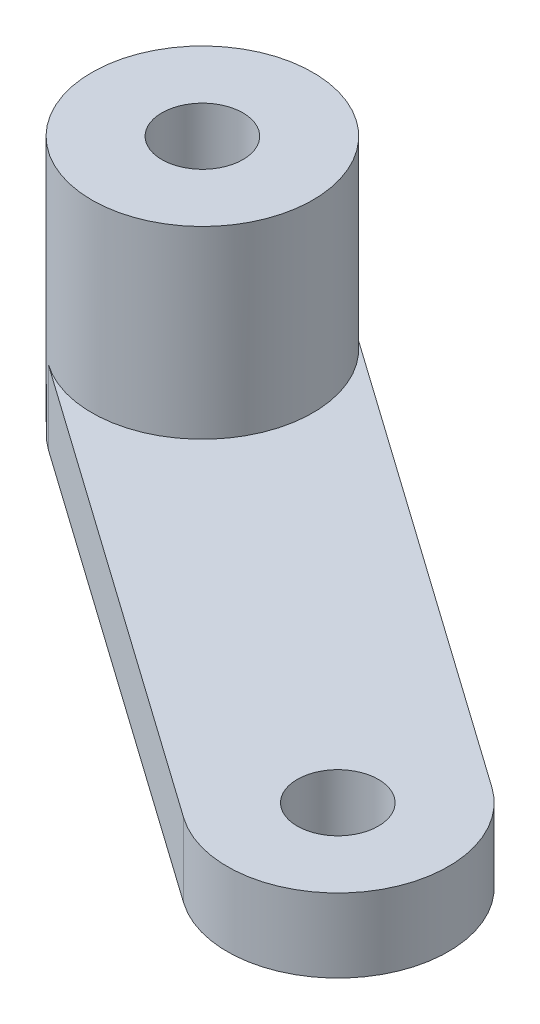
ISO-10303-21;
HEADER;
FILE_DESCRIPTION(('STEP AP214'),'2;1');
FILE_NAME('part.step','',(''),(''),'','','');
FILE_SCHEMA(('AUTOMOTIVE_DESIGN { 1 0 10303 214 1 1 1 1 }'));
ENDSEC;
DATA;
#1=APPLICATION_CONTEXT('core data for automotive mechanical design processes');
#2=APPLICATION_PROTOCOL_DEFINITION('international standard','automotive_design',2000,#1);
#3=PRODUCT_CONTEXT('',#1,'mechanical');
#4=PRODUCT('Part','Part','',(#3));
#5=PRODUCT_RELATED_PRODUCT_CATEGORY('part','',(#4));
#6=PRODUCT_DEFINITION_FORMATION('','',#4);
#7=PRODUCT_DEFINITION_CONTEXT('part definition',#1,'design');
#8=PRODUCT_DEFINITION('design','',#6,#7);
#9=PRODUCT_DEFINITION_SHAPE('','',#8);
#10=(LENGTH_UNIT() NAMED_UNIT(*) SI_UNIT(.MILLI.,.METRE.));
#11=(NAMED_UNIT(*) PLANE_ANGLE_UNIT() SI_UNIT($,.RADIAN.));
#12=(NAMED_UNIT(*) SI_UNIT($,.STERADIAN.) SOLID_ANGLE_UNIT());
#13=UNCERTAINTY_MEASURE_WITH_UNIT(LENGTH_MEASURE(1.E-05),#10,'distance_accuracy_value','');
#14=(GEOMETRIC_REPRESENTATION_CONTEXT(3) GLOBAL_UNCERTAINTY_ASSIGNED_CONTEXT((#13)) GLOBAL_UNIT_ASSIGNED_CONTEXT((#10,
#11,#12)) REPRESENTATION_CONTEXT('',''));
#15=CARTESIAN_POINT('',(0.,0.,0.));
#16=DIRECTION('',(0.,0.,1.));
#17=DIRECTION('',(1.,0.,0.));
#18=AXIS2_PLACEMENT_3D('',#15,#16,#17);
#19=CARTESIAN_POINT('',(-17.5,2.,-13.825));
#20=DIRECTION('',(0.,-1.,0.));
#21=DIRECTION('',(0.,0.,-1.));
#22=AXIS2_PLACEMENT_3D('',#19,#20,#21);
#23=CYLINDRICAL_SURFACE('',#22,3.);
#24=CARTESIAN_POINT('',(-17.5,0.,-13.825));
#25=DIRECTION('',(0.,1.,0.));
#26=DIRECTION('',(0.,0.,1.));
#27=AXIS2_PLACEMENT_3D('',#24,#25,#26);
#28=CIRCLE('',#27,3.);
#29=CARTESIAN_POINT('',(-15.7697579734994,0.,-16.2757677429187));
#30=VERTEX_POINT('',#29);
#31=CARTESIAN_POINT('',(-19.2302420265006,0.,-11.3742322570813));
#32=VERTEX_POINT('',#31);
#33=EDGE_CURVE('E98',#30,#32,#28,.T.);
#34=ORIENTED_EDGE('',*,*,#33,.T.);
#35=DIRECTION('',(0.,-1.,0.));
#36=VECTOR('',#35,1.);
#37=CARTESIAN_POINT('',(-19.2302420265006,2.,-11.3742322570813));
#38=LINE('',#37,#36);
#39=CARTESIAN_POINT('',(-19.2302420265006,2.,-11.3742322570813));
#40=VERTEX_POINT('',#39);
#41=EDGE_CURVE('E42',#40,#32,#38,.T.);
#42=ORIENTED_EDGE('',*,*,#41,.F.);
#43=CARTESIAN_POINT('',(-17.5,2.,-13.825));
#44=DIRECTION('',(0.,1.,0.));
#45=DIRECTION('',(0.,0.,1.));
#46=AXIS2_PLACEMENT_3D('',#43,#44,#45);
#47=CIRCLE('',#46,3.);
#48=CARTESIAN_POINT('',(-15.7697579734994,2.,-16.2757677429187));
#49=VERTEX_POINT('',#48);
#50=EDGE_CURVE('E11',#40,#49,#47,.T.);
#51=ORIENTED_EDGE('',*,*,#50,.T.);
#52=DIRECTION('',(0.,-1.,0.));
#53=VECTOR('',#52,1.);
#54=CARTESIAN_POINT('',(-15.7697579734994,2.,-16.2757677429187));
#55=LINE('',#54,#53);
#56=EDGE_CURVE('E85',#49,#30,#55,.T.);
#57=ORIENTED_EDGE('',*,*,#56,.T.);
#58=EDGE_LOOP('',(#34,#42,#51,#57));
#59=FACE_BOUND('',#58,.T.);
#60=CARTESIAN_POINT('',(-17.5,7.,-13.825));
#61=DIRECTION('',(0.,1.,0.));
#62=DIRECTION('',(0.,0.,1.));
#63=AXIS2_PLACEMENT_3D('',#60,#61,#62);
#64=CIRCLE('',#63,3.);
#65=CARTESIAN_POINT('',(-17.5,7.,-10.825));
#66=VERTEX_POINT('',#65);
#67=EDGE_CURVE('E109',#66,#66,#64,.T.);
#68=ORIENTED_EDGE('',*,*,#67,.F.);
#69=EDGE_LOOP('',(#68));
#70=FACE_BOUND('',#69,.T.);
#71=ADVANCED_FACE('F39',(#59,#70),#23,.T.);
#72=CARTESIAN_POINT('',(-19.2302420265006,2.,-11.3742322570813));
#73=DIRECTION('',(0.576747342166876,0.,-0.816922580972912));
#74=DIRECTION('',(-0.816922580972912,0.,-0.576747342166876));
#75=AXIS2_PLACEMENT_3D('',#72,#73,#74);
#76=PLANE('',#75);
#77=DIRECTION('',(0.816922580972912,0.,0.576747342166876));
#78=VECTOR('',#77,1.);
#79=CARTESIAN_POINT('',(-19.2302420265006,0.,-11.3742322570813));
#80=LINE('',#79,#78);
#81=CARTESIAN_POINT('',(-6.73024202650063,0.,-2.54923225708127));
#82=VERTEX_POINT('',#81);
#83=EDGE_CURVE('E107',#32,#82,#80,.T.);
#84=ORIENTED_EDGE('',*,*,#83,.T.);
#85=DIRECTION('',(0.,-1.,0.));
#86=VECTOR('',#85,1.);
#87=CARTESIAN_POINT('',(-6.73024202650063,2.,-2.54923225708127));
#88=LINE('',#87,#86);
#89=CARTESIAN_POINT('',(-6.73024202650063,2.,-2.54923225708127));
#90=VERTEX_POINT('',#89);
#91=EDGE_CURVE('E100',#90,#82,#88,.T.);
#92=ORIENTED_EDGE('',*,*,#91,.F.);
#93=DIRECTION('',(0.816922580972912,0.,0.576747342166876));
#94=VECTOR('',#93,1.);
#95=CARTESIAN_POINT('',(-19.2302420265006,2.,-11.3742322570813));
#96=LINE('',#95,#94);
#97=EDGE_CURVE('E105',#40,#90,#96,.T.);
#98=ORIENTED_EDGE('',*,*,#97,.F.);
#99=ORIENTED_EDGE('',*,*,#41,.T.);
#100=EDGE_LOOP('',(#84,#92,#98,#99));
#101=FACE_BOUND('',#100,.T.);
#102=ADVANCED_FACE('F137',(#101),#76,.F.);
#103=CARTESIAN_POINT('',(-5.,2.,-5.));
#104=DIRECTION('',(0.,-1.,0.));
#105=DIRECTION('',(0.,0.,-1.));
#106=AXIS2_PLACEMENT_3D('',#103,#104,#105);
#107=CYLINDRICAL_SURFACE('',#106,3.);
#108=CARTESIAN_POINT('',(-5.,0.,-5.));
#109=DIRECTION('',(0.,1.,0.));
#110=DIRECTION('',(0.,0.,1.));
#111=AXIS2_PLACEMENT_3D('',#108,#109,#110);
#112=CIRCLE('',#111,3.);
#113=CARTESIAN_POINT('',(-3.26975797349937,0.,-7.45076774291874));
#114=VERTEX_POINT('',#113);
#115=EDGE_CURVE('E73',#82,#114,#112,.T.);
#116=ORIENTED_EDGE('',*,*,#115,.T.);
#117=DIRECTION('',(0.,-1.,0.));
#118=VECTOR('',#117,1.);
#119=CARTESIAN_POINT('',(-3.26975797349937,2.,-7.45076774291874));
#120=LINE('',#119,#118);
#121=CARTESIAN_POINT('',(-3.26975797349937,2.,-7.45076774291874));
#122=VERTEX_POINT('',#121);
#123=EDGE_CURVE('E91',#122,#114,#120,.T.);
#124=ORIENTED_EDGE('',*,*,#123,.F.);
#125=CARTESIAN_POINT('',(-5.,2.,-5.));
#126=DIRECTION('',(0.,1.,0.));
#127=DIRECTION('',(0.,0.,1.));
#128=AXIS2_PLACEMENT_3D('',#125,#126,#127);
#129=CIRCLE('',#128,3.);
#130=EDGE_CURVE('E56',#90,#122,#129,.T.);
#131=ORIENTED_EDGE('',*,*,#130,.F.);
#132=ORIENTED_EDGE('',*,*,#91,.T.);
#133=EDGE_LOOP('',(#116,#124,#131,#132));
#134=FACE_BOUND('',#133,.T.);
#135=ADVANCED_FACE('F138',(#134),#107,.T.);
#136=CARTESIAN_POINT('',(-15.7697579734994,2.,-16.2757677429187));
#137=DIRECTION('',(-0.576747342166877,0.,0.816922580972912));
#138=DIRECTION('',(0.816922580972912,0.,0.576747342166877));
#139=AXIS2_PLACEMENT_3D('',#136,#137,#138);
#140=PLANE('',#139);
#141=DIRECTION('',(-0.816922580972912,0.,-0.576747342166877));
#142=VECTOR('',#141,1.);
#143=CARTESIAN_POINT('',(-15.7697579734994,0.,-16.2757677429187));
#144=LINE('',#143,#142);
#145=EDGE_CURVE('E79',#114,#30,#144,.T.);
#146=ORIENTED_EDGE('',*,*,#145,.T.);
#147=ORIENTED_EDGE('',*,*,#56,.F.);
#148=DIRECTION('',(-0.816922580972912,0.,-0.576747342166877));
#149=VECTOR('',#148,1.);
#150=CARTESIAN_POINT('',(-15.7697579734994,2.,-16.2757677429187));
#151=LINE('',#150,#149);
#152=EDGE_CURVE('E87',#122,#49,#151,.T.);
#153=ORIENTED_EDGE('',*,*,#152,.F.);
#154=ORIENTED_EDGE('',*,*,#123,.T.);
#155=EDGE_LOOP('',(#146,#147,#153,#154));
#156=FACE_BOUND('',#155,.T.);
#157=ADVANCED_FACE('F86',(#156),#140,.F.);
#158=CARTESIAN_POINT('',(-17.5,2.,-13.825));
#159=DIRECTION('',(0.,1.,0.));
#160=DIRECTION('',(0.,0.,1.));
#161=AXIS2_PLACEMENT_3D('',#158,#159,#160);
#162=PLANE('',#161);
#163=CARTESIAN_POINT('',(-5.,2.,-5.));
#164=DIRECTION('',(0.,1.,0.));
#165=DIRECTION('',(0.,0.,1.));
#166=AXIS2_PLACEMENT_3D('',#163,#164,#165);
#167=CIRCLE('',#166,1.1);
#168=CARTESIAN_POINT('',(-5.,2.,-3.9));
#169=VERTEX_POINT('',#168);
#170=EDGE_CURVE('E118',#169,#169,#167,.T.);
#171=ORIENTED_EDGE('',*,*,#170,.F.);
#172=EDGE_LOOP('',(#171));
#173=FACE_BOUND('',#172,.T.);
#174=ORIENTED_EDGE('',*,*,#50,.F.);
#175=ORIENTED_EDGE('',*,*,#97,.T.);
#176=ORIENTED_EDGE('',*,*,#130,.T.);
#177=ORIENTED_EDGE('',*,*,#152,.T.);
#178=EDGE_LOOP('',(#174,#175,#176,#177));
#179=FACE_BOUND('',#178,.T.);
#180=ADVANCED_FACE('F93',(#173,#179),#162,.T.);
#181=CARTESIAN_POINT('',(-17.5,0.,-13.825));
#182=DIRECTION('',(0.,1.,0.));
#183=DIRECTION('',(0.,0.,1.));
#184=AXIS2_PLACEMENT_3D('',#181,#182,#183);
#185=PLANE('',#184);
#186=CARTESIAN_POINT('',(-5.,0.,-5.));
#187=DIRECTION('',(0.,-1.,0.));
#188=DIRECTION('',(0.,0.,-1.));
#189=AXIS2_PLACEMENT_3D('',#186,#187,#188);
#190=CIRCLE('',#189,1.1);
#191=CARTESIAN_POINT('',(-5.,0.,-6.1));
#192=VERTEX_POINT('',#191);
#193=EDGE_CURVE('E121',#192,#192,#190,.T.);
#194=ORIENTED_EDGE('',*,*,#193,.F.);
#195=EDGE_LOOP('',(#194));
#196=FACE_BOUND('',#195,.T.);
#197=CARTESIAN_POINT('',(-17.5,0.,-13.825));
#198=DIRECTION('',(0.,-1.,0.));
#199=DIRECTION('',(0.,0.,-1.));
#200=AXIS2_PLACEMENT_3D('',#197,#198,#199);
#201=CIRCLE('',#200,1.1);
#202=CARTESIAN_POINT('',(-17.5,0.,-14.925));
#203=VERTEX_POINT('',#202);
#204=EDGE_CURVE('E122',#203,#203,#201,.T.);
#205=ORIENTED_EDGE('',*,*,#204,.F.);
#206=EDGE_LOOP('',(#205));
#207=FACE_BOUND('',#206,.T.);
#208=ORIENTED_EDGE('',*,*,#33,.F.);
#209=ORIENTED_EDGE('',*,*,#145,.F.);
#210=ORIENTED_EDGE('',*,*,#115,.F.);
#211=ORIENTED_EDGE('',*,*,#83,.F.);
#212=EDGE_LOOP('',(#208,#209,#210,#211));
#213=FACE_BOUND('',#212,.T.);
#214=ADVANCED_FACE('F130',(#196,#207,#213),#185,.F.);
#215=CARTESIAN_POINT('',(-17.5,7.,-13.825));
#216=DIRECTION('',(0.,1.,0.));
#217=DIRECTION('',(0.,0.,1.));
#218=AXIS2_PLACEMENT_3D('',#215,#216,#217);
#219=PLANE('',#218);
#220=ORIENTED_EDGE('',*,*,#67,.T.);
#221=EDGE_LOOP('',(#220));
#222=FACE_BOUND('',#221,.T.);
#223=CARTESIAN_POINT('',(-17.5,7.,-13.825));
#224=DIRECTION('',(0.,1.,0.));
#225=DIRECTION('',(0.,0.,1.));
#226=AXIS2_PLACEMENT_3D('',#223,#224,#225);
#227=CIRCLE('',#226,1.1);
#228=CARTESIAN_POINT('',(-17.5,7.,-12.725));
#229=VERTEX_POINT('',#228);
#230=EDGE_CURVE('E115',#229,#229,#227,.T.);
#231=ORIENTED_EDGE('',*,*,#230,.F.);
#232=EDGE_LOOP('',(#231));
#233=FACE_BOUND('',#232,.T.);
#234=ADVANCED_FACE('F133',(#222,#233),#219,.T.);
#235=CARTESIAN_POINT('',(-17.5,7.,-13.825));
#236=DIRECTION('',(0.,-1.,0.));
#237=DIRECTION('',(0.,0.,-1.));
#238=AXIS2_PLACEMENT_3D('',#235,#236,#237);
#239=CYLINDRICAL_SURFACE('',#238,1.1);
#240=ORIENTED_EDGE('',*,*,#204,.T.);
#241=EDGE_LOOP('',(#240));
#242=FACE_BOUND('',#241,.T.);
#243=ORIENTED_EDGE('',*,*,#230,.T.);
#244=EDGE_LOOP('',(#243));
#245=FACE_BOUND('',#244,.T.);
#246=ADVANCED_FACE('F164',(#242,#245),#239,.F.);
#247=CARTESIAN_POINT('',(-5.,5.,-5.));
#248=DIRECTION('',(0.,-1.,0.));
#249=DIRECTION('',(0.,0.,-1.));
#250=AXIS2_PLACEMENT_3D('',#247,#248,#249);
#251=CYLINDRICAL_SURFACE('',#250,1.1);
#252=ORIENTED_EDGE('',*,*,#170,.T.);
#253=EDGE_LOOP('',(#252));
#254=FACE_BOUND('',#253,.T.);
#255=ORIENTED_EDGE('',*,*,#193,.T.);
#256=EDGE_LOOP('',(#255));
#257=FACE_BOUND('',#256,.T.);
#258=ADVANCED_FACE('F128',(#254,#257),#251,.F.);
#259=CLOSED_SHELL('',(#71,#102,#135,#157,#180,#214,#234,#246,#258));
#260=MANIFOLD_SOLID_BREP('B2',#259);
#261=ADVANCED_BREP_SHAPE_REPRESENTATION('',(#18,#260),#14);
#262=SHAPE_DEFINITION_REPRESENTATION(#9,#261);
ENDSEC;
END-ISO-10303-21;
